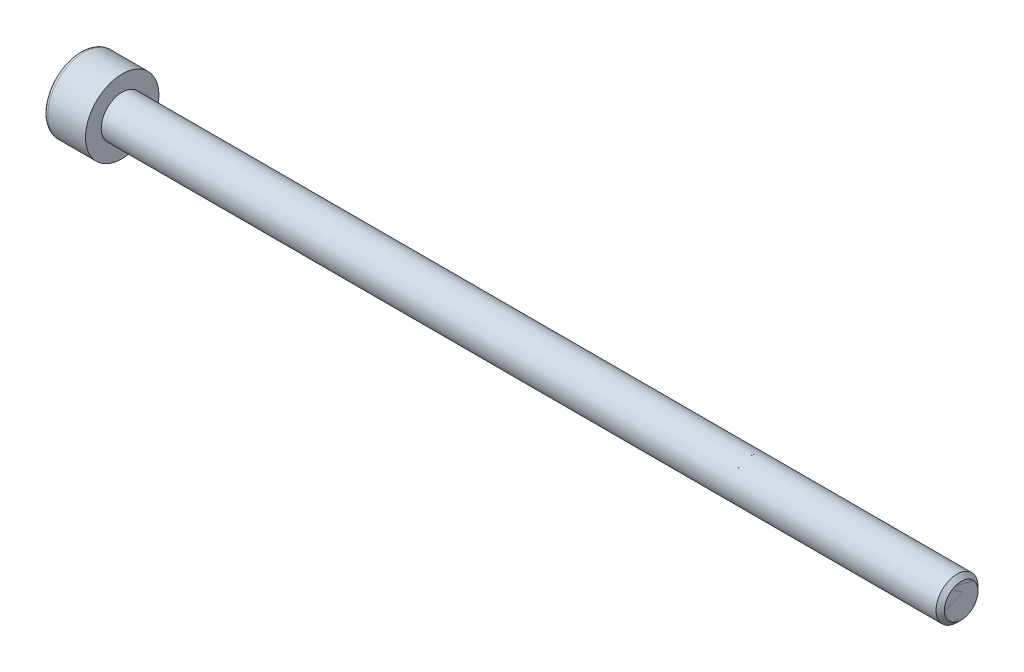
ISO-10303-21;
HEADER;
FILE_DESCRIPTION(('STEP AP214'),'2;1');
FILE_NAME('part.step','',(''),(''),'','','');
FILE_SCHEMA(('AUTOMOTIVE_DESIGN { 1 0 10303 214 1 1 1 1 }'));
ENDSEC;
DATA;
#1=APPLICATION_CONTEXT('core data for automotive mechanical design processes');
#2=APPLICATION_PROTOCOL_DEFINITION('international standard','automotive_design',2000,#1);
#3=PRODUCT_CONTEXT('',#1,'mechanical');
#4=PRODUCT('Part','Part','',(#3));
#5=PRODUCT_RELATED_PRODUCT_CATEGORY('part','',(#4));
#6=PRODUCT_DEFINITION_FORMATION('','',#4);
#7=PRODUCT_DEFINITION_CONTEXT('part definition',#1,'design');
#8=PRODUCT_DEFINITION('design','',#6,#7);
#9=PRODUCT_DEFINITION_SHAPE('','',#8);
#10=(LENGTH_UNIT() NAMED_UNIT(*) SI_UNIT(.MILLI.,.METRE.));
#11=(NAMED_UNIT(*) PLANE_ANGLE_UNIT() SI_UNIT($,.RADIAN.));
#12=(NAMED_UNIT(*) SI_UNIT($,.STERADIAN.) SOLID_ANGLE_UNIT());
#13=UNCERTAINTY_MEASURE_WITH_UNIT(LENGTH_MEASURE(1.E-05),#10,'distance_accuracy_value','');
#14=(GEOMETRIC_REPRESENTATION_CONTEXT(3) GLOBAL_UNCERTAINTY_ASSIGNED_CONTEXT((#13)) GLOBAL_UNIT_ASSIGNED_CONTEXT((#10,
#11,#12)) REPRESENTATION_CONTEXT('',''));
#15=CARTESIAN_POINT('',(0.,0.,0.));
#16=DIRECTION('',(0.,0.,1.));
#17=DIRECTION('',(1.,0.,0.));
#18=AXIS2_PLACEMENT_3D('',#15,#16,#17);
#19=CARTESIAN_POINT('',(64.,0.,0.));
#20=DIRECTION('',(1.,0.,0.));
#21=DIRECTION('',(0.,0.,-1.));
#22=AXIS2_PLACEMENT_3D('',#19,#20,#21);
#23=PLANE('',#22);
#24=CARTESIAN_POINT('',(64.,-2.,0.));
#25=CARTESIAN_POINT('',(64.,-1.99774586766325,-0.402717718090076));
#26=CARTESIAN_POINT('',(64.,-1.84788068745405,-0.764664479633677));
#27=CARTESIAN_POINT('',(64.,-1.69532712507373,-1.13310408507384));
#28=CARTESIAN_POINT('',(64.,-1.41417740186145,-1.41429353376039));
#29=CARTESIAN_POINT('',(64.,-1.13318421417824,-1.69532642479994));
#30=CARTESIAN_POINT('',(64.,-0.765364797462188,-1.8477599065349));
#31=CARTESIAN_POINT('',(64.,-0.398369886191421,-1.99985169278011));
#32=CARTESIAN_POINT('',(64.,0.,-1.99995802016326));
#33=CARTESIAN_POINT('',(64.,0.397297997638056,-2.00006406145273));
#34=CARTESIAN_POINT('',(64.,0.765364797462188,-1.8477599065349));
#35=CARTESIAN_POINT('',(64.,1.13227384248478,-1.69593482461887));
#36=CARTESIAN_POINT('',(64.,1.41417740186145,-1.41429353376039));
#37=CARTESIAN_POINT('',(64.,1.69472319973728,-1.13400874121154));
#38=CARTESIAN_POINT('',(64.,1.84788068745406,-0.764664479633658));
#39=CARTESIAN_POINT('',(64.,1.99774279237885,-0.403267140808738));
#40=CARTESIAN_POINT('',(64.,2.,0.));
#41=B_SPLINE_CURVE_WITH_KNOTS('',2,(#24,#25,#26,#27,#28,#29,#30,#31,#32,#33,#34,#35,#36,#37,#38,
#39,#40),.UNSPECIFIED.,.F.,.F.,(3,2,2,2,2,2,2,2,3),(0.,0.125,0.25,0.375,0.5,0.625,0.75,0.875,
1.),.UNSPECIFIED.);
#42=CARTESIAN_POINT('',(64.,-2.,0.));
#43=VERTEX_POINT('',#42);
#44=CARTESIAN_POINT('',(64.,2.,0.));
#45=VERTEX_POINT('',#44);
#46=EDGE_CURVE('P0_E32',#43,#45,#41,.T.);
#47=ORIENTED_EDGE('',*,*,#46,.F.);
#48=CARTESIAN_POINT('',(64.,2.,0.));
#49=CARTESIAN_POINT('',(64.,1.99774586766324,0.402717718090762));
#50=CARTESIAN_POINT('',(64.,1.84788068745406,0.764664479633658));
#51=CARTESIAN_POINT('',(64.,1.69532712507302,1.13310408507488));
#52=CARTESIAN_POINT('',(64.,1.41417740186145,1.41429353376039));
#53=CARTESIAN_POINT('',(64.,1.13318421417782,1.69532642480003));
#54=CARTESIAN_POINT('',(64.,0.765364797462188,1.8477599065349));
#55=CARTESIAN_POINT('',(64.,0.398369886191615,1.99985169278011));
#56=CARTESIAN_POINT('',(64.,0.,1.99995802016326));
#57=CARTESIAN_POINT('',(64.,-0.39729799763825,2.00006406145273));
#58=CARTESIAN_POINT('',(64.,-0.765364797462188,1.8477599065349));
#59=CARTESIAN_POINT('',(64.,-1.13227384248465,1.69593482461884));
#60=CARTESIAN_POINT('',(64.,-1.41417740186145,1.41429353376039));
#61=CARTESIAN_POINT('',(64.,-1.69472319973738,1.13400874121161));
#62=CARTESIAN_POINT('',(64.,-1.84788068745405,0.764664479633677));
#63=CARTESIAN_POINT('',(64.,-1.99774279237885,0.403267140808441));
#64=CARTESIAN_POINT('',(64.,-2.,0.));
#65=B_SPLINE_CURVE_WITH_KNOTS('',2,(#48,#49,#50,#51,#52,#53,#54,#55,#56,#57,#58,#59,#60,#61,#62,
#63,#64),.UNSPECIFIED.,.F.,.F.,(3,2,2,2,2,2,2,2,3),(0.,0.125,0.25,0.375,0.5,0.625,0.75,0.875,
1.),.UNSPECIFIED.);
#66=EDGE_CURVE('P0_E30',#45,#43,#65,.T.);
#67=ORIENTED_EDGE('',*,*,#66,.F.);
#68=EDGE_LOOP('',(#47,#67));
#69=FACE_BOUND('',#68,.T.);
#70=ADVANCED_FACE('P0_F17',(#69),#23,.F.);
#71=CARTESIAN_POINT('',(84.,0.,0.));
#72=DIRECTION('',(1.,0.,0.));
#73=DIRECTION('',(0.,0.,-1.));
#74=AXIS2_PLACEMENT_3D('',#71,#72,#73);
#75=PLANE('',#74);
#76=CARTESIAN_POINT('',(84.,0.,0.));
#77=DIRECTION('',(1.,0.,0.));
#78=DIRECTION('',(0.,0.,-1.));
#79=AXIS2_PLACEMENT_3D('',#76,#77,#78);
#80=CIRCLE('',#79,1.6);
#81=CARTESIAN_POINT('',(84.,0.,-1.6));
#82=VERTEX_POINT('',#81);
#83=EDGE_CURVE('P0_E20',#82,#82,#80,.F.);
#84=ORIENTED_EDGE('',*,*,#83,.F.);
#85=EDGE_LOOP('',(#84));
#86=FACE_BOUND('',#85,.T.);
#87=ADVANCED_FACE('P0_F50',(#86),#75,.T.);
#88=CARTESIAN_POINT('',(64.,0.,0.));
#89=DIRECTION('',(1.,0.,0.));
#90=DIRECTION('',(0.,0.,-1.));
#91=AXIS2_PLACEMENT_3D('',#88,#89,#90);
#92=PLANE('',#91);
#93=CARTESIAN_POINT('',(64.,0.,0.));
#94=DIRECTION('',(1.,0.,0.));
#95=DIRECTION('',(0.,0.,-1.));
#96=AXIS2_PLACEMENT_3D('',#93,#94,#95);
#97=CIRCLE('',#96,1.6);
#98=CARTESIAN_POINT('',(64.,0.,-1.6));
#99=VERTEX_POINT('',#98);
#100=EDGE_CURVE('P0_E11',#99,#99,#97,.T.);
#101=ORIENTED_EDGE('',*,*,#100,.F.);
#102=EDGE_LOOP('',(#101));
#103=FACE_BOUND('',#102,.T.);
#104=ORIENTED_EDGE('',*,*,#46,.T.);
#105=ORIENTED_EDGE('',*,*,#66,.T.);
#106=EDGE_LOOP('',(#104,#105));
#107=FACE_BOUND('',#106,.T.);
#108=ADVANCED_FACE('P0_F35',(#103,#107),#92,.T.);
#109=CARTESIAN_POINT('',(63.,0.,0.));
#110=DIRECTION('',(1.,0.,0.));
#111=DIRECTION('',(0.,0.,-1.));
#112=AXIS2_PLACEMENT_3D('',#109,#110,#111);
#113=CYLINDRICAL_SURFACE('',#112,1.6);
#114=ORIENTED_EDGE('',*,*,#83,.T.);
#115=EDGE_LOOP('',(#114));
#116=FACE_BOUND('',#115,.T.);
#117=ORIENTED_EDGE('',*,*,#100,.T.);
#118=EDGE_LOOP('',(#117));
#119=FACE_BOUND('',#118,.T.);
#120=ADVANCED_FACE('P0_F49',(#116,#119),#113,.T.);
#121=CLOSED_SHELL('',(#70,#87,#108,#120));
#122=MANIFOLD_SOLID_BREP('P0_B1',#121);
#123=CARTESIAN_POINT('',(2.,1.5,-0.8660254037844));
#124=DIRECTION('',(0.,0.500000000000017,-0.866025403784429));
#125=DIRECTION('',(0.,0.866025403784429,0.500000000000017));
#126=AXIS2_PLACEMENT_3D('',#123,#124,#125);
#127=PLANE('',#126);
#128=DIRECTION('',(0.,0.866025403784429,0.500000000000017));
#129=VECTOR('',#128,1.);
#130=CARTESIAN_POINT('',(2.,1.5,-0.8660254037844));
#131=LINE('',#130,#129);
#132=CARTESIAN_POINT('',(2.,1.5,-0.8660254037844));
#133=VERTEX_POINT('',#132);
#134=CARTESIAN_POINT('',(2.,0.,-1.73205080756895));
#135=VERTEX_POINT('',#134);
#136=EDGE_CURVE('P1_E71',#133,#135,#131,.F.);
#137=ORIENTED_EDGE('',*,*,#136,.F.);
#138=DIRECTION('',(1.,0.,0.));
#139=VECTOR('',#138,1.);
#140=CARTESIAN_POINT('',(2.,1.5,-0.8660254037844));
#141=LINE('',#140,#139);
#142=CARTESIAN_POINT('',(0.,1.5,-0.8660254037844));
#143=VERTEX_POINT('',#142);
#144=EDGE_CURVE('P1_E95',#133,#143,#141,.F.);
#145=ORIENTED_EDGE('',*,*,#144,.T.);
#146=DIRECTION('',(0.,0.866025403784429,0.500000000000017));
#147=VECTOR('',#146,1.);
#148=CARTESIAN_POINT('',(0.,1.5,-0.8660254037844));
#149=LINE('',#148,#147);
#150=CARTESIAN_POINT('',(0.,0.,-1.73205080756898));
#151=VERTEX_POINT('',#150);
#152=EDGE_CURVE('P1_E81',#151,#143,#149,.T.);
#153=ORIENTED_EDGE('',*,*,#152,.F.);
#154=DIRECTION('',(1.,0.,0.));
#155=VECTOR('',#154,1.);
#156=CARTESIAN_POINT('',(2.,0.,-1.732050807569));
#157=LINE('',#156,#155);
#158=EDGE_CURVE('P1_E90',#151,#135,#157,.T.);
#159=ORIENTED_EDGE('',*,*,#158,.T.);
#160=EDGE_LOOP('',(#137,#145,#153,#159));
#161=FACE_BOUND('',#160,.T.);
#162=ADVANCED_FACE('P1_F17',(#161),#127,.F.);
#163=CARTESIAN_POINT('',(2.,0.,-1.732050807569));
#164=DIRECTION('',(0.,-0.500000000000017,-0.866025403784429));
#165=DIRECTION('',(0.,0.866025403784429,-0.500000000000017));
#166=AXIS2_PLACEMENT_3D('',#163,#164,#165);
#167=PLANE('',#166);
#168=DIRECTION('',(0.,0.866025403784429,-0.500000000000017));
#169=VECTOR('',#168,1.);
#170=CARTESIAN_POINT('',(2.,0.,-1.732050807569));
#171=LINE('',#170,#169);
#172=CARTESIAN_POINT('',(2.,-1.50000000000003,-0.866025403784446));
#173=VERTEX_POINT('',#172);
#174=EDGE_CURVE('P1_E99',#135,#173,#171,.F.);
#175=ORIENTED_EDGE('',*,*,#174,.F.);
#176=ORIENTED_EDGE('',*,*,#158,.F.);
#177=DIRECTION('',(0.,0.866025403784429,-0.500000000000017));
#178=VECTOR('',#177,1.);
#179=CARTESIAN_POINT('',(0.,0.,-1.732050807569));
#180=LINE('',#179,#178);
#181=CARTESIAN_POINT('',(0.,-1.50000000000001,-0.866025403784423));
#182=VERTEX_POINT('',#181);
#183=EDGE_CURVE('P1_E76',#182,#151,#180,.T.);
#184=ORIENTED_EDGE('',*,*,#183,.F.);
#185=DIRECTION('',(1.,0.,0.));
#186=VECTOR('',#185,1.);
#187=CARTESIAN_POINT('',(2.,-1.5,-0.8660254037844));
#188=LINE('',#187,#186);
#189=EDGE_CURVE('P1_E168',#182,#173,#188,.T.);
#190=ORIENTED_EDGE('',*,*,#189,.T.);
#191=EDGE_LOOP('',(#175,#176,#184,#190));
#192=FACE_BOUND('',#191,.T.);
#193=ADVANCED_FACE('P1_F98',(#192),#167,.F.);
#194=CARTESIAN_POINT('',(2.,1.5,0.8660254037844));
#195=DIRECTION('',(0.,1.,0.));
#196=DIRECTION('',(0.,0.,1.));
#197=AXIS2_PLACEMENT_3D('',#194,#195,#196);
#198=PLANE('',#197);
#199=DIRECTION('',(0.,0.,1.));
#200=VECTOR('',#199,1.);
#201=CARTESIAN_POINT('',(2.,1.5,0.));
#202=LINE('',#201,#200);
#203=CARTESIAN_POINT('',(2.,1.50000000000001,0.866025403784423));
#204=VERTEX_POINT('',#203);
#205=EDGE_CURVE('P1_E166',#204,#133,#202,.F.);
#206=ORIENTED_EDGE('',*,*,#205,.F.);
#207=DIRECTION('',(1.,0.,0.));
#208=VECTOR('',#207,1.);
#209=CARTESIAN_POINT('',(2.,1.50000000000005,0.866025403784492));
#210=LINE('',#209,#208);
#211=CARTESIAN_POINT('',(0.,1.50000000000001,0.866025403784423));
#212=VERTEX_POINT('',#211);
#213=EDGE_CURVE('P1_E155',#204,#212,#210,.F.);
#214=ORIENTED_EDGE('',*,*,#213,.T.);
#215=DIRECTION('',(0.,0.,1.));
#216=VECTOR('',#215,1.);
#217=CARTESIAN_POINT('',(0.,1.5,0.8660254037844));
#218=LINE('',#217,#216);
#219=EDGE_CURVE('P1_E101',#143,#212,#218,.T.);
#220=ORIENTED_EDGE('',*,*,#219,.F.);
#221=ORIENTED_EDGE('',*,*,#144,.F.);
#222=EDGE_LOOP('',(#206,#214,#220,#221));
#223=FACE_BOUND('',#222,.T.);
#224=ADVANCED_FACE('P1_F174',(#223),#198,.F.);
#225=CARTESIAN_POINT('',(2.,-1.5,-0.8660254037844));
#226=DIRECTION('',(0.,-1.,0.));
#227=DIRECTION('',(0.,0.,-1.));
#228=AXIS2_PLACEMENT_3D('',#225,#226,#227);
#229=PLANE('',#228);
#230=DIRECTION('',(0.,0.,1.));
#231=VECTOR('',#230,1.);
#232=CARTESIAN_POINT('',(2.,-1.5,0.));
#233=LINE('',#232,#231);
#234=CARTESIAN_POINT('',(2.,-1.5,0.8660254037844));
#235=VERTEX_POINT('',#234);
#236=EDGE_CURVE('P1_E163',#173,#235,#233,.T.);
#237=ORIENTED_EDGE('',*,*,#236,.F.);
#238=ORIENTED_EDGE('',*,*,#189,.F.);
#239=DIRECTION('',(0.,0.,-1.));
#240=VECTOR('',#239,1.);
#241=CARTESIAN_POINT('',(0.,-1.5,-0.8660254037844));
#242=LINE('',#241,#240);
#243=CARTESIAN_POINT('',(0.,-1.5,0.8660254037844));
#244=VERTEX_POINT('',#243);
#245=EDGE_CURVE('P1_E85',#244,#182,#242,.T.);
#246=ORIENTED_EDGE('',*,*,#245,.F.);
#247=DIRECTION('',(1.,0.,0.));
#248=VECTOR('',#247,1.);
#249=CARTESIAN_POINT('',(2.,-1.5,0.8660254037844));
#250=LINE('',#249,#248);
#251=EDGE_CURVE('P1_E153',#244,#235,#250,.T.);
#252=ORIENTED_EDGE('',*,*,#251,.T.);
#253=EDGE_LOOP('',(#237,#238,#246,#252));
#254=FACE_BOUND('',#253,.T.);
#255=ADVANCED_FACE('P1_F268',(#254),#229,.F.);
#256=CARTESIAN_POINT('',(2.,0.,0.));
#257=DIRECTION('',(-1.,0.,0.));
#258=DIRECTION('',(0.,0.,1.));
#259=AXIS2_PLACEMENT_3D('',#256,#257,#258);
#260=PLANE('',#259);
#261=ORIENTED_EDGE('',*,*,#236,.T.);
#262=DIRECTION('',(0.,-0.866025403784429,-0.500000000000017));
#263=VECTOR('',#262,1.);
#264=CARTESIAN_POINT('',(2.,-1.5,0.8660254037844));
#265=LINE('',#264,#263);
#266=CARTESIAN_POINT('',(2.,0.,1.73205080756898));
#267=VERTEX_POINT('',#266);
#268=EDGE_CURVE('P1_E151',#235,#267,#265,.F.);
#269=ORIENTED_EDGE('',*,*,#268,.T.);
#270=DIRECTION('',(0.,-0.866025403784429,0.500000000000017));
#271=VECTOR('',#270,1.);
#272=CARTESIAN_POINT('',(2.,0.,1.732050807569));
#273=LINE('',#272,#271);
#274=EDGE_CURVE('P1_E158',#267,#204,#273,.F.);
#275=ORIENTED_EDGE('',*,*,#274,.T.);
#276=ORIENTED_EDGE('',*,*,#205,.T.);
#277=ORIENTED_EDGE('',*,*,#136,.T.);
#278=ORIENTED_EDGE('',*,*,#174,.T.);
#279=EDGE_LOOP('',(#261,#269,#275,#276,#277,#278));
#280=FACE_BOUND('',#279,.T.);
#281=ADVANCED_FACE('P1_F259',(#280),#260,.T.);
#282=CARTESIAN_POINT('',(2.,0.,1.732050807569));
#283=DIRECTION('',(0.,0.500000000000017,0.866025403784429));
#284=DIRECTION('',(0.,-0.866025403784429,0.500000000000017));
#285=AXIS2_PLACEMENT_3D('',#282,#283,#284);
#286=PLANE('',#285);
#287=ORIENTED_EDGE('',*,*,#274,.F.);
#288=DIRECTION('',(1.,0.,0.));
#289=VECTOR('',#288,1.);
#290=CARTESIAN_POINT('',(2.,0.,1.73205080756891));
#291=LINE('',#290,#289);
#292=CARTESIAN_POINT('',(0.,0.,1.73205080756898));
#293=VERTEX_POINT('',#292);
#294=EDGE_CURVE('P1_E142',#267,#293,#291,.F.);
#295=ORIENTED_EDGE('',*,*,#294,.T.);
#296=DIRECTION('',(0.,-0.866025403784429,0.500000000000017));
#297=VECTOR('',#296,1.);
#298=CARTESIAN_POINT('',(0.,0.,1.732050807569));
#299=LINE('',#298,#297);
#300=EDGE_CURVE('P1_E161',#212,#293,#299,.T.);
#301=ORIENTED_EDGE('',*,*,#300,.F.);
#302=ORIENTED_EDGE('',*,*,#213,.F.);
#303=EDGE_LOOP('',(#287,#295,#301,#302));
#304=FACE_BOUND('',#303,.T.);
#305=ADVANCED_FACE('P1_F177',(#304),#286,.F.);
#306=CARTESIAN_POINT('',(2.,-1.5,0.8660254037844));
#307=DIRECTION('',(0.,-0.500000000000017,0.866025403784429));
#308=DIRECTION('',(0.,-0.866025403784429,-0.500000000000017));
#309=AXIS2_PLACEMENT_3D('',#306,#307,#308);
#310=PLANE('',#309);
#311=ORIENTED_EDGE('',*,*,#268,.F.);
#312=ORIENTED_EDGE('',*,*,#251,.F.);
#313=DIRECTION('',(0.,-0.866025403784398,-0.50000000000007));
#314=VECTOR('',#313,1.);
#315=CARTESIAN_POINT('',(0.,0.,1.732050807569));
#316=LINE('',#315,#314);
#317=EDGE_CURVE('P1_E150',#293,#244,#316,.T.);
#318=ORIENTED_EDGE('',*,*,#317,.F.);
#319=ORIENTED_EDGE('',*,*,#294,.F.);
#320=EDGE_LOOP('',(#311,#312,#318,#319));
#321=FACE_BOUND('',#320,.T.);
#322=ADVANCED_FACE('P1_F183',(#321),#310,.F.);
#323=CARTESIAN_POINT('',(0.,0.,0.));
#324=DIRECTION('',(-1.,0.,0.));
#325=DIRECTION('',(0.,0.,1.));
#326=AXIS2_PLACEMENT_3D('',#323,#324,#325);
#327=PLANE('',#326);
#328=ORIENTED_EDGE('',*,*,#300,.T.);
#329=ORIENTED_EDGE('',*,*,#317,.T.);
#330=ORIENTED_EDGE('',*,*,#245,.T.);
#331=ORIENTED_EDGE('',*,*,#183,.T.);
#332=ORIENTED_EDGE('',*,*,#152,.T.);
#333=ORIENTED_EDGE('',*,*,#219,.T.);
#334=EDGE_LOOP('',(#328,#329,#330,#331,#332,#333));
#335=FACE_BOUND('',#334,.T.);
#336=CARTESIAN_POINT('',(0.,0.,0.));
#337=DIRECTION('',(1.,0.,0.));
#338=DIRECTION('',(0.,-1.,0.));
#339=AXIS2_PLACEMENT_3D('',#336,#337,#338);
#340=CIRCLE('',#339,3.1);
#341=CARTESIAN_POINT('',(0.,-3.1,0.));
#342=VERTEX_POINT('',#341);
#343=CARTESIAN_POINT('',(0.,3.1,0.));
#344=VERTEX_POINT('',#343);
#345=EDGE_CURVE('P1_E36',#342,#344,#340,.T.);
#346=ORIENTED_EDGE('',*,*,#345,.F.);
#347=CARTESIAN_POINT('',(0.,0.,0.));
#348=DIRECTION('',(1.,0.,0.));
#349=DIRECTION('',(0.,1.,0.));
#350=AXIS2_PLACEMENT_3D('',#347,#348,#349);
#351=CIRCLE('',#350,3.1);
#352=EDGE_CURVE('P1_E117',#344,#342,#351,.T.);
#353=ORIENTED_EDGE('',*,*,#352,.F.);
#354=EDGE_LOOP('',(#346,#353));
#355=FACE_BOUND('',#354,.T.);
#356=ADVANCED_FACE('P1_F79',(#335,#355),#327,.T.);
#357=CARTESIAN_POINT('',(0.4,0.,0.));
#358=DIRECTION('',(-1.,0.,0.));
#359=DIRECTION('',(0.,1.,0.));
#360=AXIS2_PLACEMENT_3D('',#357,#358,#359);
#361=TOROIDAL_SURFACE('',#360,3.1,0.4);
#362=CARTESIAN_POINT('',(0.399999999999998,0.,0.));
#363=DIRECTION('',(-1.,0.,0.));
#364=DIRECTION('',(0.,0.,1.));
#365=AXIS2_PLACEMENT_3D('',#362,#363,#364);
#366=CIRCLE('',#365,3.5);
#367=CARTESIAN_POINT('',(0.399999999999998,0.,3.5));
#368=VERTEX_POINT('',#367);
#369=EDGE_CURVE('P1_E113',#368,#368,#366,.F.);
#370=ORIENTED_EDGE('',*,*,#369,.F.);
#371=EDGE_LOOP('',(#370));
#372=FACE_BOUND('',#371,.T.);
#373=ORIENTED_EDGE('',*,*,#352,.T.);
#374=ORIENTED_EDGE('',*,*,#345,.T.);
#375=EDGE_LOOP('',(#373,#374));
#376=FACE_BOUND('',#375,.T.);
#377=ADVANCED_FACE('P1_F125',(#372,#376),#361,.T.);
#378=CARTESIAN_POINT('',(88.2,0.,0.));
#379=DIRECTION('',(-1.,0.,0.));
#380=DIRECTION('',(0.,0.,1.));
#381=AXIS2_PLACEMENT_3D('',#378,#379,#380);
#382=CYLINDRICAL_SURFACE('',#381,3.5);
#383=CARTESIAN_POINT('',(4.,0.,0.));
#384=DIRECTION('',(-1.,0.,0.));
#385=DIRECTION('',(0.,0.,1.));
#386=AXIS2_PLACEMENT_3D('',#383,#384,#385);
#387=CIRCLE('',#386,3.5);
#388=CARTESIAN_POINT('',(4.,0.,3.5));
#389=VERTEX_POINT('',#388);
#390=EDGE_CURVE('P1_E111',#389,#389,#387,.T.);
#391=ORIENTED_EDGE('',*,*,#390,.T.);
#392=EDGE_LOOP('',(#391));
#393=FACE_BOUND('',#392,.T.);
#394=ORIENTED_EDGE('',*,*,#369,.T.);
#395=EDGE_LOOP('',(#394));
#396=FACE_BOUND('',#395,.T.);
#397=ADVANCED_FACE('P1_F130',(#393,#396),#382,.T.);
#398=CARTESIAN_POINT('',(84.,0.,0.));
#399=DIRECTION('',(-1.,0.,0.));
#400=DIRECTION('',(0.,0.,1.));
#401=AXIS2_PLACEMENT_3D('',#398,#399,#400);
#402=PLANE('',#401);
#403=CARTESIAN_POINT('',(84.0000000000032,0.,0.));
#404=DIRECTION('',(-1.,0.,0.));
#405=DIRECTION('',(0.,0.,1.));
#406=AXIS2_PLACEMENT_3D('',#403,#404,#405);
#407=CIRCLE('',#406,1.59999999999627);
#408=CARTESIAN_POINT('',(84.0000000000032,0.,1.59999999999627));
#409=VERTEX_POINT('',#408);
#410=EDGE_CURVE('P1_E108',#409,#409,#407,.T.);
#411=ORIENTED_EDGE('',*,*,#410,.F.);
#412=EDGE_LOOP('',(#411));
#413=FACE_BOUND('',#412,.T.);
#414=ADVANCED_FACE('P1_F219',(#413),#402,.F.);
#415=CARTESIAN_POINT('',(4.,0.,0.));
#416=DIRECTION('',(-1.,0.,0.));
#417=DIRECTION('',(0.,0.,1.));
#418=AXIS2_PLACEMENT_3D('',#415,#416,#417);
#419=PLANE('',#418);
#420=CARTESIAN_POINT('',(4.,0.,0.));
#421=DIRECTION('',(-1.,0.,0.));
#422=DIRECTION('',(0.,0.,1.));
#423=AXIS2_PLACEMENT_3D('',#420,#421,#422);
#424=CIRCLE('',#423,2.);
#425=CARTESIAN_POINT('',(4.,0.,2.));
#426=VERTEX_POINT('',#425);
#427=EDGE_CURVE('P1_E28',#426,#426,#424,.F.);
#428=ORIENTED_EDGE('',*,*,#427,.F.);
#429=EDGE_LOOP('',(#428));
#430=FACE_BOUND('',#429,.T.);
#431=ORIENTED_EDGE('',*,*,#390,.F.);
#432=EDGE_LOOP('',(#431));
#433=FACE_BOUND('',#432,.T.);
#434=ADVANCED_FACE('P1_F213',(#430,#433),#419,.F.);
#435=CARTESIAN_POINT('',(83.6000000001036,0.,0.));
#436=DIRECTION('',(-1.,0.,0.));
#437=DIRECTION('',(0.,0.,1.));
#438=AXIS2_PLACEMENT_3D('',#435,#436,#437);
#439=CONICAL_SURFACE('',#438,1.99999999989586,0.785398163397448);
#440=ORIENTED_EDGE('',*,*,#410,.T.);
#441=EDGE_LOOP('',(#440));
#442=FACE_BOUND('',#441,.T.);
#443=CARTESIAN_POINT('',(83.6,0.,0.));
#444=DIRECTION('',(-1.,0.,0.));
#445=DIRECTION('',(0.,0.,1.));
#446=AXIS2_PLACEMENT_3D('',#443,#444,#445);
#447=CIRCLE('',#446,2.);
#448=CARTESIAN_POINT('',(83.6,0.,2.));
#449=VERTEX_POINT('',#448);
#450=EDGE_CURVE('P1_E11',#449,#449,#447,.T.);
#451=ORIENTED_EDGE('',*,*,#450,.F.);
#452=EDGE_LOOP('',(#451));
#453=FACE_BOUND('',#452,.T.);
#454=ADVANCED_FACE('P1_F207',(#442,#453),#439,.T.);
#455=CARTESIAN_POINT('',(88.2,0.,0.));
#456=DIRECTION('',(-1.,0.,0.));
#457=DIRECTION('',(0.,0.,1.));
#458=AXIS2_PLACEMENT_3D('',#455,#456,#457);
#459=CYLINDRICAL_SURFACE('',#458,2.);
#460=ORIENTED_EDGE('',*,*,#450,.T.);
#461=EDGE_LOOP('',(#460));
#462=FACE_BOUND('',#461,.T.);
#463=ORIENTED_EDGE('',*,*,#427,.T.);
#464=EDGE_LOOP('',(#463));
#465=FACE_BOUND('',#464,.T.);
#466=ADVANCED_FACE('P1_F205',(#462,#465),#459,.T.);
#467=CLOSED_SHELL('',(#162,#193,#224,#255,#281,#305,#322,#356,#377,#397,#414,#434,#454,#466));
#468=MANIFOLD_SOLID_BREP('P1_B1',#467);
#469=ADVANCED_BREP_SHAPE_REPRESENTATION('',(#18,#122,#468),#14);
#470=SHAPE_DEFINITION_REPRESENTATION(#9,#469);
ENDSEC;
END-ISO-10303-21;
